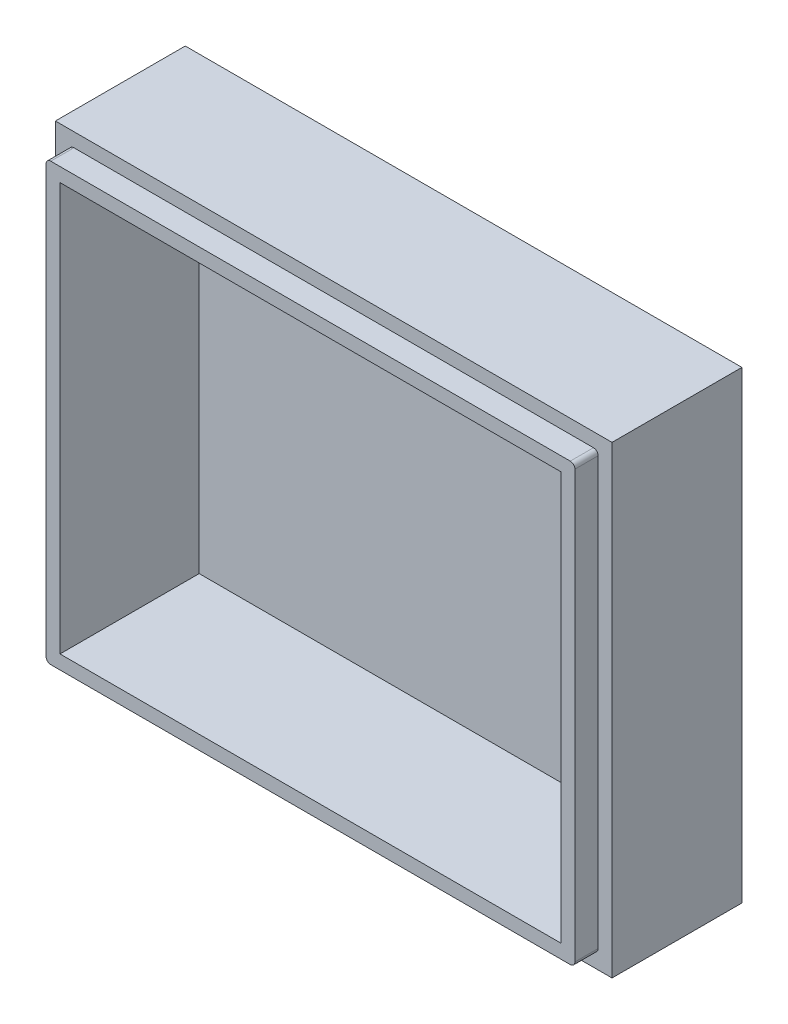
ISO-10303-21;
HEADER;
FILE_DESCRIPTION(('STEP AP214'),'2;1');
FILE_NAME('part.step','',(''),(''),'','','');
FILE_SCHEMA(('AUTOMOTIVE_DESIGN { 1 0 10303 214 1 1 1 1 }'));
ENDSEC;
DATA;
#1=APPLICATION_CONTEXT('core data for automotive mechanical design processes');
#2=APPLICATION_PROTOCOL_DEFINITION('international standard','automotive_design',2000,#1);
#3=PRODUCT_CONTEXT('',#1,'mechanical');
#4=PRODUCT('Part','Part','',(#3));
#5=PRODUCT_RELATED_PRODUCT_CATEGORY('part','',(#4));
#6=PRODUCT_DEFINITION_FORMATION('','',#4);
#7=PRODUCT_DEFINITION_CONTEXT('part definition',#1,'design');
#8=PRODUCT_DEFINITION('design','',#6,#7);
#9=PRODUCT_DEFINITION_SHAPE('','',#8);
#10=(LENGTH_UNIT() NAMED_UNIT(*) SI_UNIT(.MILLI.,.METRE.));
#11=(NAMED_UNIT(*) PLANE_ANGLE_UNIT() SI_UNIT($,.RADIAN.));
#12=(NAMED_UNIT(*) SI_UNIT($,.STERADIAN.) SOLID_ANGLE_UNIT());
#13=UNCERTAINTY_MEASURE_WITH_UNIT(LENGTH_MEASURE(1.E-05),#10,'distance_accuracy_value','');
#14=(GEOMETRIC_REPRESENTATION_CONTEXT(3) GLOBAL_UNCERTAINTY_ASSIGNED_CONTEXT((#13)) GLOBAL_UNIT_ASSIGNED_CONTEXT((#10,
#11,#12)) REPRESENTATION_CONTEXT('',''));
#15=CARTESIAN_POINT('',(0.,0.,0.));
#16=DIRECTION('',(0.,0.,1.));
#17=DIRECTION('',(1.,0.,0.));
#18=AXIS2_PLACEMENT_3D('',#15,#16,#17);
#19=CARTESIAN_POINT('',(120.,0.,3.));
#20=DIRECTION('',(0.,1.,0.));
#21=DIRECTION('',(0.,0.,1.));
#22=AXIS2_PLACEMENT_3D('',#19,#20,#21);
#23=PLANE('',#22);
#24=DIRECTION('',(1.,0.,0.));
#25=VECTOR('',#24,1.);
#26=CARTESIAN_POINT('',(120.,0.,0.));
#27=LINE('',#26,#25);
#28=CARTESIAN_POINT('',(0.,0.,0.));
#29=VERTEX_POINT('',#28);
#30=CARTESIAN_POINT('',(120.,0.,0.));
#31=VERTEX_POINT('',#30);
#32=EDGE_CURVE('E222',#29,#31,#27,.T.);
#33=ORIENTED_EDGE('',*,*,#32,.T.);
#34=DIRECTION('',(0.,0.,-1.));
#35=VECTOR('',#34,1.);
#36=CARTESIAN_POINT('',(120.,0.,3.));
#37=LINE('',#36,#35);
#38=CARTESIAN_POINT('',(120.,0.,28.));
#39=VERTEX_POINT('',#38);
#40=EDGE_CURVE('E240',#39,#31,#37,.T.);
#41=ORIENTED_EDGE('',*,*,#40,.F.);
#42=DIRECTION('',(1.,0.,0.));
#43=VECTOR('',#42,1.);
#44=CARTESIAN_POINT('',(0.,0.,28.));
#45=LINE('',#44,#43);
#46=CARTESIAN_POINT('',(0.,0.,28.));
#47=VERTEX_POINT('',#46);
#48=EDGE_CURVE('E213',#47,#39,#45,.T.);
#49=ORIENTED_EDGE('',*,*,#48,.F.);
#50=DIRECTION('',(0.,0.,-1.));
#51=VECTOR('',#50,1.);
#52=CARTESIAN_POINT('',(0.,0.,3.));
#53=LINE('',#52,#51);
#54=EDGE_CURVE('E231',#47,#29,#53,.T.);
#55=ORIENTED_EDGE('',*,*,#54,.T.);
#56=EDGE_LOOP('',(#33,#41,#49,#55));
#57=FACE_BOUND('',#56,.T.);
#58=ADVANCED_FACE('F33',(#57),#23,.F.);
#59=CARTESIAN_POINT('',(120.,100.,3.));
#60=DIRECTION('',(-1.,0.,0.));
#61=DIRECTION('',(0.,0.,1.));
#62=AXIS2_PLACEMENT_3D('',#59,#60,#61);
#63=PLANE('',#62);
#64=DIRECTION('',(0.,1.,0.));
#65=VECTOR('',#64,1.);
#66=CARTESIAN_POINT('',(120.,100.,0.));
#67=LINE('',#66,#65);
#68=CARTESIAN_POINT('',(120.,100.,0.));
#69=VERTEX_POINT('',#68);
#70=EDGE_CURVE('E225',#31,#69,#67,.T.);
#71=ORIENTED_EDGE('',*,*,#70,.T.);
#72=DIRECTION('',(0.,0.,-1.));
#73=VECTOR('',#72,1.);
#74=CARTESIAN_POINT('',(120.,100.,3.));
#75=LINE('',#74,#73);
#76=CARTESIAN_POINT('',(120.,100.,28.));
#77=VERTEX_POINT('',#76);
#78=EDGE_CURVE('E237',#77,#69,#75,.T.);
#79=ORIENTED_EDGE('',*,*,#78,.F.);
#80=DIRECTION('',(0.,1.,0.));
#81=VECTOR('',#80,1.);
#82=CARTESIAN_POINT('',(120.,100.,28.));
#83=LINE('',#82,#81);
#84=EDGE_CURVE('E216',#39,#77,#83,.T.);
#85=ORIENTED_EDGE('',*,*,#84,.F.);
#86=ORIENTED_EDGE('',*,*,#40,.T.);
#87=EDGE_LOOP('',(#71,#79,#85,#86));
#88=FACE_BOUND('',#87,.T.);
#89=ADVANCED_FACE('F318',(#88),#63,.F.);
#90=CARTESIAN_POINT('',(0.,100.,3.));
#91=DIRECTION('',(0.,-1.,0.));
#92=DIRECTION('',(0.,0.,-1.));
#93=AXIS2_PLACEMENT_3D('',#90,#91,#92);
#94=PLANE('',#93);
#95=DIRECTION('',(-1.,0.,0.));
#96=VECTOR('',#95,1.);
#97=CARTESIAN_POINT('',(0.,100.,0.));
#98=LINE('',#97,#96);
#99=CARTESIAN_POINT('',(0.,100.,0.));
#100=VERTEX_POINT('',#99);
#101=EDGE_CURVE('E227',#69,#100,#98,.T.);
#102=ORIENTED_EDGE('',*,*,#101,.T.);
#103=DIRECTION('',(0.,0.,-1.));
#104=VECTOR('',#103,1.);
#105=CARTESIAN_POINT('',(0.,100.,3.));
#106=LINE('',#105,#104);
#107=CARTESIAN_POINT('',(0.,100.,28.));
#108=VERTEX_POINT('',#107);
#109=EDGE_CURVE('E234',#108,#100,#106,.T.);
#110=ORIENTED_EDGE('',*,*,#109,.F.);
#111=DIRECTION('',(-1.,0.,0.));
#112=VECTOR('',#111,1.);
#113=CARTESIAN_POINT('',(0.,100.,28.));
#114=LINE('',#113,#112);
#115=EDGE_CURVE('E219',#77,#108,#114,.T.);
#116=ORIENTED_EDGE('',*,*,#115,.F.);
#117=ORIENTED_EDGE('',*,*,#78,.T.);
#118=EDGE_LOOP('',(#102,#110,#116,#117));
#119=FACE_BOUND('',#118,.T.);
#120=ADVANCED_FACE('F323',(#119),#94,.F.);
#121=CARTESIAN_POINT('',(0.,0.,3.));
#122=DIRECTION('',(1.,0.,0.));
#123=DIRECTION('',(0.,0.,-1.));
#124=AXIS2_PLACEMENT_3D('',#121,#122,#123);
#125=PLANE('',#124);
#126=DIRECTION('',(0.,-1.,0.));
#127=VECTOR('',#126,1.);
#128=CARTESIAN_POINT('',(0.,0.,0.));
#129=LINE('',#128,#127);
#130=EDGE_CURVE('E229',#100,#29,#129,.T.);
#131=ORIENTED_EDGE('',*,*,#130,.T.);
#132=ORIENTED_EDGE('',*,*,#54,.F.);
#133=DIRECTION('',(0.,-1.,0.));
#134=VECTOR('',#133,1.);
#135=CARTESIAN_POINT('',(0.,100.,28.));
#136=LINE('',#135,#134);
#137=EDGE_CURVE('E210',#108,#47,#136,.T.);
#138=ORIENTED_EDGE('',*,*,#137,.F.);
#139=ORIENTED_EDGE('',*,*,#109,.T.);
#140=EDGE_LOOP('',(#131,#132,#138,#139));
#141=FACE_BOUND('',#140,.T.);
#142=ADVANCED_FACE('F329',(#141),#125,.F.);
#143=CARTESIAN_POINT('',(0.,0.,0.));
#144=DIRECTION('',(0.,0.,-1.));
#145=DIRECTION('',(-1.,0.,0.));
#146=AXIS2_PLACEMENT_3D('',#143,#144,#145);
#147=PLANE('',#146);
#148=ORIENTED_EDGE('',*,*,#32,.F.);
#149=ORIENTED_EDGE('',*,*,#130,.F.);
#150=ORIENTED_EDGE('',*,*,#101,.F.);
#151=ORIENTED_EDGE('',*,*,#70,.F.);
#152=EDGE_LOOP('',(#148,#149,#150,#151));
#153=FACE_BOUND('',#152,.T.);
#154=ADVANCED_FACE('F333',(#153),#147,.T.);
#155=CARTESIAN_POINT('',(0.,0.,28.));
#156=DIRECTION('',(0.,0.,1.));
#157=DIRECTION('',(1.,0.,0.));
#158=AXIS2_PLACEMENT_3D('',#155,#156,#157);
#159=PLANE('',#158);
#160=ORIENTED_EDGE('',*,*,#137,.T.);
#161=ORIENTED_EDGE('',*,*,#48,.T.);
#162=ORIENTED_EDGE('',*,*,#84,.T.);
#163=ORIENTED_EDGE('',*,*,#115,.T.);
#164=EDGE_LOOP('',(#160,#161,#162,#163));
#165=FACE_BOUND('',#164,.T.);
#166=DIRECTION('',(1.,0.,0.));
#167=VECTOR('',#166,1.);
#168=CARTESIAN_POINT('',(117.,3.,28.));
#169=LINE('',#168,#167);
#170=CARTESIAN_POINT('',(4.,3.,28.));
#171=VERTEX_POINT('',#170);
#172=CARTESIAN_POINT('',(116.,3.,28.));
#173=VERTEX_POINT('',#172);
#174=EDGE_CURVE('E202',#171,#173,#169,.T.);
#175=ORIENTED_EDGE('',*,*,#174,.F.);
#176=CARTESIAN_POINT('',(4.,4.,28.));
#177=DIRECTION('',(0.,0.,1.));
#178=DIRECTION('',(1.,0.,0.));
#179=AXIS2_PLACEMENT_3D('',#176,#177,#178);
#180=CIRCLE('',#179,1.);
#181=CARTESIAN_POINT('',(3.,4.,28.));
#182=VERTEX_POINT('',#181);
#183=EDGE_CURVE('E270',#171,#182,#180,.F.);
#184=ORIENTED_EDGE('',*,*,#183,.T.);
#185=DIRECTION('',(0.,-1.,0.));
#186=VECTOR('',#185,1.);
#187=CARTESIAN_POINT('',(3.,3.,28.));
#188=LINE('',#187,#186);
#189=CARTESIAN_POINT('',(3.,96.,28.));
#190=VERTEX_POINT('',#189);
#191=EDGE_CURVE('E199',#190,#182,#188,.T.);
#192=ORIENTED_EDGE('',*,*,#191,.F.);
#193=CARTESIAN_POINT('',(4.,96.,28.));
#194=DIRECTION('',(0.,0.,1.));
#195=DIRECTION('',(1.,0.,0.));
#196=AXIS2_PLACEMENT_3D('',#193,#194,#195);
#197=CIRCLE('',#196,1.);
#198=CARTESIAN_POINT('',(4.,97.,28.));
#199=VERTEX_POINT('',#198);
#200=EDGE_CURVE('E41',#190,#199,#197,.F.);
#201=ORIENTED_EDGE('',*,*,#200,.T.);
#202=DIRECTION('',(-1.,0.,0.));
#203=VECTOR('',#202,1.);
#204=CARTESIAN_POINT('',(3.,97.,28.));
#205=LINE('',#204,#203);
#206=CARTESIAN_POINT('',(116.,97.,28.));
#207=VERTEX_POINT('',#206);
#208=EDGE_CURVE('E208',#207,#199,#205,.T.);
#209=ORIENTED_EDGE('',*,*,#208,.F.);
#210=CARTESIAN_POINT('',(116.,96.,28.));
#211=DIRECTION('',(0.,0.,1.));
#212=DIRECTION('',(1.,0.,0.));
#213=AXIS2_PLACEMENT_3D('',#210,#211,#212);
#214=CIRCLE('',#213,1.);
#215=CARTESIAN_POINT('',(117.,96.,28.));
#216=VERTEX_POINT('',#215);
#217=EDGE_CURVE('E11',#207,#216,#214,.F.);
#218=ORIENTED_EDGE('',*,*,#217,.T.);
#219=DIRECTION('',(0.,1.,0.));
#220=VECTOR('',#219,1.);
#221=CARTESIAN_POINT('',(117.,97.,28.));
#222=LINE('',#221,#220);
#223=CARTESIAN_POINT('',(117.,4.,28.));
#224=VERTEX_POINT('',#223);
#225=EDGE_CURVE('E205',#224,#216,#222,.T.);
#226=ORIENTED_EDGE('',*,*,#225,.F.);
#227=CARTESIAN_POINT('',(116.,4.,28.));
#228=DIRECTION('',(0.,0.,1.));
#229=DIRECTION('',(1.,0.,0.));
#230=AXIS2_PLACEMENT_3D('',#227,#228,#229);
#231=CIRCLE('',#230,1.);
#232=EDGE_CURVE('E272',#224,#173,#231,.F.);
#233=ORIENTED_EDGE('',*,*,#232,.T.);
#234=EDGE_LOOP('',(#175,#184,#192,#201,#209,#218,#226,#233));
#235=FACE_BOUND('',#234,.T.);
#236=ADVANCED_FACE('F275',(#165,#235),#159,.T.);
#237=CARTESIAN_POINT('',(0.,0.,33.));
#238=DIRECTION('',(0.,0.,1.));
#239=DIRECTION('',(1.,0.,0.));
#240=AXIS2_PLACEMENT_3D('',#237,#238,#239);
#241=PLANE('',#240);
#242=DIRECTION('',(0.,-1.,0.));
#243=VECTOR('',#242,1.);
#244=CARTESIAN_POINT('',(3.,97.,33.));
#245=LINE('',#244,#243);
#246=CARTESIAN_POINT('',(3.,96.,33.));
#247=VERTEX_POINT('',#246);
#248=CARTESIAN_POINT('',(3.,4.,33.));
#249=VERTEX_POINT('',#248);
#250=EDGE_CURVE('E164',#247,#249,#245,.T.);
#251=ORIENTED_EDGE('',*,*,#250,.T.);
#252=CARTESIAN_POINT('',(4.,4.,33.));
#253=DIRECTION('',(0.,0.,1.));
#254=DIRECTION('',(1.,0.,0.));
#255=AXIS2_PLACEMENT_3D('',#252,#253,#254);
#256=CIRCLE('',#255,1.);
#257=CARTESIAN_POINT('',(4.,3.,33.));
#258=VERTEX_POINT('',#257);
#259=EDGE_CURVE('E259',#249,#258,#256,.T.);
#260=ORIENTED_EDGE('',*,*,#259,.T.);
#261=DIRECTION('',(1.,0.,0.));
#262=VECTOR('',#261,1.);
#263=CARTESIAN_POINT('',(3.,3.,33.));
#264=LINE('',#263,#262);
#265=CARTESIAN_POINT('',(116.,3.,33.));
#266=VERTEX_POINT('',#265);
#267=EDGE_CURVE('E190',#258,#266,#264,.T.);
#268=ORIENTED_EDGE('',*,*,#267,.T.);
#269=CARTESIAN_POINT('',(116.,4.,33.));
#270=DIRECTION('',(0.,0.,1.));
#271=DIRECTION('',(1.,0.,0.));
#272=AXIS2_PLACEMENT_3D('',#269,#270,#271);
#273=CIRCLE('',#272,1.);
#274=CARTESIAN_POINT('',(117.,4.,33.));
#275=VERTEX_POINT('',#274);
#276=EDGE_CURVE('E257',#266,#275,#273,.T.);
#277=ORIENTED_EDGE('',*,*,#276,.T.);
#278=DIRECTION('',(0.,1.,0.));
#279=VECTOR('',#278,1.);
#280=CARTESIAN_POINT('',(117.,97.,33.));
#281=LINE('',#280,#279);
#282=CARTESIAN_POINT('',(117.,96.,33.));
#283=VERTEX_POINT('',#282);
#284=EDGE_CURVE('E193',#275,#283,#281,.T.);
#285=ORIENTED_EDGE('',*,*,#284,.T.);
#286=CARTESIAN_POINT('',(116.,96.,33.));
#287=DIRECTION('',(0.,0.,1.));
#288=DIRECTION('',(1.,0.,0.));
#289=AXIS2_PLACEMENT_3D('',#286,#287,#288);
#290=CIRCLE('',#289,1.);
#291=CARTESIAN_POINT('',(116.,97.,33.));
#292=VERTEX_POINT('',#291);
#293=EDGE_CURVE('E253',#283,#292,#290,.T.);
#294=ORIENTED_EDGE('',*,*,#293,.T.);
#295=DIRECTION('',(-1.,0.,0.));
#296=VECTOR('',#295,1.);
#297=CARTESIAN_POINT('',(3.,97.,33.));
#298=LINE('',#297,#296);
#299=CARTESIAN_POINT('',(4.,97.,33.));
#300=VERTEX_POINT('',#299);
#301=EDGE_CURVE('E196',#292,#300,#298,.T.);
#302=ORIENTED_EDGE('',*,*,#301,.T.);
#303=CARTESIAN_POINT('',(4.,96.,33.));
#304=DIRECTION('',(0.,0.,1.));
#305=DIRECTION('',(1.,0.,0.));
#306=AXIS2_PLACEMENT_3D('',#303,#304,#305);
#307=CIRCLE('',#306,1.);
#308=EDGE_CURVE('E255',#300,#247,#307,.T.);
#309=ORIENTED_EDGE('',*,*,#308,.T.);
#310=EDGE_LOOP('',(#251,#260,#268,#277,#285,#294,#302,#309));
#311=FACE_BOUND('',#310,.T.);
#312=DIRECTION('',(1.,0.,0.));
#313=VECTOR('',#312,1.);
#314=CARTESIAN_POINT('',(114.,6.00000000000001,33.));
#315=LINE('',#314,#313);
#316=CARTESIAN_POINT('',(6.,6.00000000000001,33.));
#317=VERTEX_POINT('',#316);
#318=CARTESIAN_POINT('',(114.,6.00000000000001,33.));
#319=VERTEX_POINT('',#318);
#320=EDGE_CURVE('E156',#317,#319,#315,.T.);
#321=ORIENTED_EDGE('',*,*,#320,.F.);
#322=DIRECTION('',(0.,-1.,0.));
#323=VECTOR('',#322,1.);
#324=CARTESIAN_POINT('',(6.,6.00000000000001,33.));
#325=LINE('',#324,#323);
#326=CARTESIAN_POINT('',(6.,94.,33.));
#327=VERTEX_POINT('',#326);
#328=EDGE_CURVE('E146',#327,#317,#325,.T.);
#329=ORIENTED_EDGE('',*,*,#328,.F.);
#330=DIRECTION('',(-1.,0.,0.));
#331=VECTOR('',#330,1.);
#332=CARTESIAN_POINT('',(6.,94.,33.));
#333=LINE('',#332,#331);
#334=CARTESIAN_POINT('',(114.,94.,33.));
#335=VERTEX_POINT('',#334);
#336=EDGE_CURVE('E172',#335,#327,#333,.T.);
#337=ORIENTED_EDGE('',*,*,#336,.F.);
#338=DIRECTION('',(0.,1.,0.));
#339=VECTOR('',#338,1.);
#340=CARTESIAN_POINT('',(114.,94.,33.));
#341=LINE('',#340,#339);
#342=EDGE_CURVE('E170',#319,#335,#341,.T.);
#343=ORIENTED_EDGE('',*,*,#342,.F.);
#344=EDGE_LOOP('',(#321,#329,#337,#343));
#345=FACE_BOUND('',#344,.T.);
#346=ADVANCED_FACE('F168',(#311,#345),#241,.T.);
#347=CARTESIAN_POINT('',(3.,97.,33.));
#348=DIRECTION('',(1.,0.,0.));
#349=DIRECTION('',(0.,0.,-1.));
#350=AXIS2_PLACEMENT_3D('',#347,#348,#349);
#351=PLANE('',#350);
#352=ORIENTED_EDGE('',*,*,#191,.T.);
#353=DIRECTION('',(0.,0.,-1.));
#354=VECTOR('',#353,1.);
#355=CARTESIAN_POINT('',(3.,4.,33.));
#356=LINE('',#355,#354);
#357=EDGE_CURVE('E251',#182,#249,#356,.F.);
#358=ORIENTED_EDGE('',*,*,#357,.T.);
#359=ORIENTED_EDGE('',*,*,#250,.F.);
#360=DIRECTION('',(0.,0.,-1.));
#361=VECTOR('',#360,1.);
#362=CARTESIAN_POINT('',(3.,96.,33.));
#363=LINE('',#362,#361);
#364=EDGE_CURVE('E248',#247,#190,#363,.T.);
#365=ORIENTED_EDGE('',*,*,#364,.T.);
#366=EDGE_LOOP('',(#352,#358,#359,#365));
#367=FACE_BOUND('',#366,.T.);
#368=ADVANCED_FACE('F301',(#367),#351,.F.);
#369=CARTESIAN_POINT('',(3.,3.,33.));
#370=DIRECTION('',(0.,1.,0.));
#371=DIRECTION('',(0.,0.,1.));
#372=AXIS2_PLACEMENT_3D('',#369,#370,#371);
#373=PLANE('',#372);
#374=ORIENTED_EDGE('',*,*,#267,.F.);
#375=DIRECTION('',(0.,0.,-1.));
#376=VECTOR('',#375,1.);
#377=CARTESIAN_POINT('',(4.,3.,33.));
#378=LINE('',#377,#376);
#379=EDGE_CURVE('E245',#258,#171,#378,.T.);
#380=ORIENTED_EDGE('',*,*,#379,.T.);
#381=ORIENTED_EDGE('',*,*,#174,.T.);
#382=DIRECTION('',(0.,0.,-1.));
#383=VECTOR('',#382,1.);
#384=CARTESIAN_POINT('',(116.,3.,33.));
#385=LINE('',#384,#383);
#386=EDGE_CURVE('E243',#173,#266,#385,.F.);
#387=ORIENTED_EDGE('',*,*,#386,.T.);
#388=EDGE_LOOP('',(#374,#380,#381,#387));
#389=FACE_BOUND('',#388,.T.);
#390=ADVANCED_FACE('F281',(#389),#373,.F.);
#391=CARTESIAN_POINT('',(117.,97.,33.));
#392=DIRECTION('',(-1.,0.,0.));
#393=DIRECTION('',(0.,0.,1.));
#394=AXIS2_PLACEMENT_3D('',#391,#392,#393);
#395=PLANE('',#394);
#396=ORIENTED_EDGE('',*,*,#284,.F.);
#397=DIRECTION('',(0.,0.,-1.));
#398=VECTOR('',#397,1.);
#399=CARTESIAN_POINT('',(117.,4.,33.));
#400=LINE('',#399,#398);
#401=EDGE_CURVE('E263',#275,#224,#400,.T.);
#402=ORIENTED_EDGE('',*,*,#401,.T.);
#403=ORIENTED_EDGE('',*,*,#225,.T.);
#404=DIRECTION('',(0.,0.,-1.));
#405=VECTOR('',#404,1.);
#406=CARTESIAN_POINT('',(117.,96.,33.));
#407=LINE('',#406,#405);
#408=EDGE_CURVE('E261',#216,#283,#407,.F.);
#409=ORIENTED_EDGE('',*,*,#408,.T.);
#410=EDGE_LOOP('',(#396,#402,#403,#409));
#411=FACE_BOUND('',#410,.T.);
#412=ADVANCED_FACE('F289',(#411),#395,.F.);
#413=CARTESIAN_POINT('',(3.,97.,33.));
#414=DIRECTION('',(0.,-1.,0.));
#415=DIRECTION('',(0.,0.,-1.));
#416=AXIS2_PLACEMENT_3D('',#413,#414,#415);
#417=PLANE('',#416);
#418=ORIENTED_EDGE('',*,*,#208,.T.);
#419=DIRECTION('',(0.,0.,-1.));
#420=VECTOR('',#419,1.);
#421=CARTESIAN_POINT('',(4.,97.,33.));
#422=LINE('',#421,#420);
#423=EDGE_CURVE('E268',#199,#300,#422,.F.);
#424=ORIENTED_EDGE('',*,*,#423,.T.);
#425=ORIENTED_EDGE('',*,*,#301,.F.);
#426=DIRECTION('',(0.,0.,-1.));
#427=VECTOR('',#426,1.);
#428=CARTESIAN_POINT('',(116.,97.,33.));
#429=LINE('',#428,#427);
#430=EDGE_CURVE('E266',#292,#207,#429,.T.);
#431=ORIENTED_EDGE('',*,*,#430,.T.);
#432=EDGE_LOOP('',(#418,#424,#425,#431));
#433=FACE_BOUND('',#432,.T.);
#434=ADVANCED_FACE('F293',(#433),#417,.F.);
#435=CARTESIAN_POINT('',(6.,6.00000000000001,33.));
#436=DIRECTION('',(1.,0.,0.));
#437=DIRECTION('',(0.,0.,-1.));
#438=AXIS2_PLACEMENT_3D('',#435,#436,#437);
#439=PLANE('',#438);
#440=DIRECTION('',(0.,-1.,0.));
#441=VECTOR('',#440,1.);
#442=CARTESIAN_POINT('',(6.,6.00000000000001,3.));
#443=LINE('',#442,#441);
#444=CARTESIAN_POINT('',(6.,94.,3.));
#445=VERTEX_POINT('',#444);
#446=CARTESIAN_POINT('',(6.,6.00000000000001,3.));
#447=VERTEX_POINT('',#446);
#448=EDGE_CURVE('E176',#445,#447,#443,.T.);
#449=ORIENTED_EDGE('',*,*,#448,.F.);
#450=DIRECTION('',(0.,0.,-1.));
#451=VECTOR('',#450,1.);
#452=CARTESIAN_POINT('',(6.,94.,33.));
#453=LINE('',#452,#451);
#454=EDGE_CURVE('E152',#327,#445,#453,.T.);
#455=ORIENTED_EDGE('',*,*,#454,.F.);
#456=ORIENTED_EDGE('',*,*,#328,.T.);
#457=DIRECTION('',(0.,0.,-1.));
#458=VECTOR('',#457,1.);
#459=CARTESIAN_POINT('',(6.,6.00000000000001,33.));
#460=LINE('',#459,#458);
#461=EDGE_CURVE('E150',#317,#447,#460,.T.);
#462=ORIENTED_EDGE('',*,*,#461,.T.);
#463=EDGE_LOOP('',(#449,#455,#456,#462));
#464=FACE_BOUND('',#463,.T.);
#465=ADVANCED_FACE('F149',(#464),#439,.T.);
#466=CARTESIAN_POINT('',(114.,6.00000000000001,33.));
#467=DIRECTION('',(0.,1.,0.));
#468=DIRECTION('',(0.,0.,1.));
#469=AXIS2_PLACEMENT_3D('',#466,#467,#468);
#470=PLANE('',#469);
#471=DIRECTION('',(1.,0.,0.));
#472=VECTOR('',#471,1.);
#473=CARTESIAN_POINT('',(114.,6.00000000000001,3.));
#474=LINE('',#473,#472);
#475=CARTESIAN_POINT('',(114.,6.00000000000001,3.));
#476=VERTEX_POINT('',#475);
#477=EDGE_CURVE('E163',#447,#476,#474,.T.);
#478=ORIENTED_EDGE('',*,*,#477,.F.);
#479=ORIENTED_EDGE('',*,*,#461,.F.);
#480=ORIENTED_EDGE('',*,*,#320,.T.);
#481=DIRECTION('',(0.,0.,-1.));
#482=VECTOR('',#481,1.);
#483=CARTESIAN_POINT('',(114.,6.00000000000001,33.));
#484=LINE('',#483,#482);
#485=EDGE_CURVE('E165',#319,#476,#484,.T.);
#486=ORIENTED_EDGE('',*,*,#485,.T.);
#487=EDGE_LOOP('',(#478,#479,#480,#486));
#488=FACE_BOUND('',#487,.T.);
#489=ADVANCED_FACE('F160',(#488),#470,.T.);
#490=CARTESIAN_POINT('',(114.,94.,33.));
#491=DIRECTION('',(-1.,0.,0.));
#492=DIRECTION('',(0.,-1.,0.));
#493=AXIS2_PLACEMENT_3D('',#490,#491,#492);
#494=PLANE('',#493);
#495=DIRECTION('',(0.,1.,0.));
#496=VECTOR('',#495,1.);
#497=CARTESIAN_POINT('',(114.,94.,3.));
#498=LINE('',#497,#496);
#499=CARTESIAN_POINT('',(114.,94.,3.));
#500=VERTEX_POINT('',#499);
#501=EDGE_CURVE('E179',#476,#500,#498,.T.);
#502=ORIENTED_EDGE('',*,*,#501,.F.);
#503=ORIENTED_EDGE('',*,*,#485,.F.);
#504=ORIENTED_EDGE('',*,*,#342,.T.);
#505=DIRECTION('',(0.,0.,-1.));
#506=VECTOR('',#505,1.);
#507=CARTESIAN_POINT('',(114.,94.,33.));
#508=LINE('',#507,#506);
#509=EDGE_CURVE('E185',#335,#500,#508,.T.);
#510=ORIENTED_EDGE('',*,*,#509,.T.);
#511=EDGE_LOOP('',(#502,#503,#504,#510));
#512=FACE_BOUND('',#511,.T.);
#513=ADVANCED_FACE('F355',(#512),#494,.T.);
#514=CARTESIAN_POINT('',(6.,94.,33.));
#515=DIRECTION('',(0.,-1.,0.));
#516=DIRECTION('',(0.,0.,-1.));
#517=AXIS2_PLACEMENT_3D('',#514,#515,#516);
#518=PLANE('',#517);
#519=DIRECTION('',(-1.,0.,0.));
#520=VECTOR('',#519,1.);
#521=CARTESIAN_POINT('',(6.,94.,3.));
#522=LINE('',#521,#520);
#523=EDGE_CURVE('E157',#500,#445,#522,.T.);
#524=ORIENTED_EDGE('',*,*,#523,.F.);
#525=ORIENTED_EDGE('',*,*,#509,.F.);
#526=ORIENTED_EDGE('',*,*,#336,.T.);
#527=ORIENTED_EDGE('',*,*,#454,.T.);
#528=EDGE_LOOP('',(#524,#525,#526,#527));
#529=FACE_BOUND('',#528,.T.);
#530=ADVANCED_FACE('F313',(#529),#518,.T.);
#531=CARTESIAN_POINT('',(0.,0.,3.));
#532=DIRECTION('',(0.,0.,-1.));
#533=DIRECTION('',(-1.,0.,0.));
#534=AXIS2_PLACEMENT_3D('',#531,#532,#533);
#535=PLANE('',#534);
#536=ORIENTED_EDGE('',*,*,#523,.T.);
#537=ORIENTED_EDGE('',*,*,#448,.T.);
#538=ORIENTED_EDGE('',*,*,#477,.T.);
#539=ORIENTED_EDGE('',*,*,#501,.T.);
#540=EDGE_LOOP('',(#536,#537,#538,#539));
#541=FACE_BOUND('',#540,.T.);
#542=ADVANCED_FACE('F306',(#541),#535,.F.);
#543=CARTESIAN_POINT('',(4.,4.,33.));
#544=DIRECTION('',(0.,0.,-1.));
#545=DIRECTION('',(-1.,0.,0.));
#546=AXIS2_PLACEMENT_3D('',#543,#544,#545);
#547=CYLINDRICAL_SURFACE('',#546,1.);
#548=ORIENTED_EDGE('',*,*,#259,.F.);
#549=ORIENTED_EDGE('',*,*,#357,.F.);
#550=ORIENTED_EDGE('',*,*,#183,.F.);
#551=ORIENTED_EDGE('',*,*,#379,.F.);
#552=EDGE_LOOP('',(#548,#549,#550,#551));
#553=FACE_BOUND('',#552,.T.);
#554=ADVANCED_FACE('F304',(#553),#547,.T.);
#555=CARTESIAN_POINT('',(116.,4.,33.));
#556=DIRECTION('',(0.,0.,-1.));
#557=DIRECTION('',(-1.,0.,0.));
#558=AXIS2_PLACEMENT_3D('',#555,#556,#557);
#559=CYLINDRICAL_SURFACE('',#558,1.);
#560=ORIENTED_EDGE('',*,*,#276,.F.);
#561=ORIENTED_EDGE('',*,*,#386,.F.);
#562=ORIENTED_EDGE('',*,*,#232,.F.);
#563=ORIENTED_EDGE('',*,*,#401,.F.);
#564=EDGE_LOOP('',(#560,#561,#562,#563));
#565=FACE_BOUND('',#564,.T.);
#566=ADVANCED_FACE('F284',(#565),#559,.T.);
#567=CARTESIAN_POINT('',(4.,96.,33.));
#568=DIRECTION('',(0.,0.,-1.));
#569=DIRECTION('',(-1.,0.,0.));
#570=AXIS2_PLACEMENT_3D('',#567,#568,#569);
#571=CYLINDRICAL_SURFACE('',#570,1.);
#572=ORIENTED_EDGE('',*,*,#308,.F.);
#573=ORIENTED_EDGE('',*,*,#423,.F.);
#574=ORIENTED_EDGE('',*,*,#200,.F.);
#575=ORIENTED_EDGE('',*,*,#364,.F.);
#576=EDGE_LOOP('',(#572,#573,#574,#575));
#577=FACE_BOUND('',#576,.T.);
#578=ADVANCED_FACE('F296',(#577),#571,.T.);
#579=CARTESIAN_POINT('',(116.,96.,33.));
#580=DIRECTION('',(0.,0.,-1.));
#581=DIRECTION('',(-1.,0.,0.));
#582=AXIS2_PLACEMENT_3D('',#579,#580,#581);
#583=CYLINDRICAL_SURFACE('',#582,1.);
#584=ORIENTED_EDGE('',*,*,#293,.F.);
#585=ORIENTED_EDGE('',*,*,#408,.F.);
#586=ORIENTED_EDGE('',*,*,#217,.F.);
#587=ORIENTED_EDGE('',*,*,#430,.F.);
#588=EDGE_LOOP('',(#584,#585,#586,#587));
#589=FACE_BOUND('',#588,.T.);
#590=ADVANCED_FACE('F35',(#589),#583,.T.);
#591=CLOSED_SHELL('',(#58,#89,#120,#142,#154,#236,#346,#368,#390,#412,#434,#465,#489,#513,#530,
#542,#554,#566,#578,#590));
#592=MANIFOLD_SOLID_BREP('B2',#591);
#593=ADVANCED_BREP_SHAPE_REPRESENTATION('',(#18,#592),#14);
#594=SHAPE_DEFINITION_REPRESENTATION(#9,#593);
ENDSEC;
END-ISO-10303-21;
